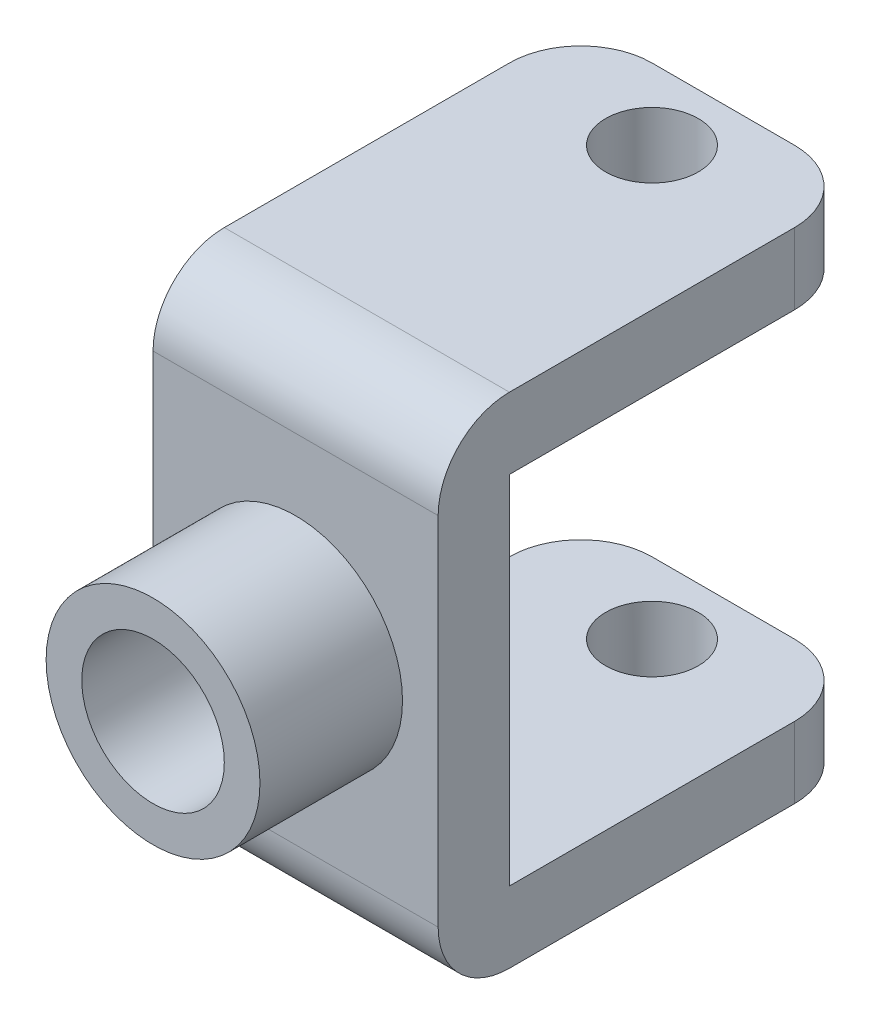
ISO-10303-21;
HEADER;
FILE_DESCRIPTION(('STEP AP214'),'2;1');
FILE_NAME('part.step','',(''),(''),'','','');
FILE_SCHEMA(('AUTOMOTIVE_DESIGN { 1 0 10303 214 1 1 1 1 }'));
ENDSEC;
DATA;
#1=APPLICATION_CONTEXT('core data for automotive mechanical design processes');
#2=APPLICATION_PROTOCOL_DEFINITION('international standard','automotive_design',2000,#1);
#3=PRODUCT_CONTEXT('',#1,'mechanical');
#4=PRODUCT('Part','Part','',(#3));
#5=PRODUCT_RELATED_PRODUCT_CATEGORY('part','',(#4));
#6=PRODUCT_DEFINITION_FORMATION('','',#4);
#7=PRODUCT_DEFINITION_CONTEXT('part definition',#1,'design');
#8=PRODUCT_DEFINITION('design','',#6,#7);
#9=PRODUCT_DEFINITION_SHAPE('','',#8);
#10=(LENGTH_UNIT() NAMED_UNIT(*) SI_UNIT(.MILLI.,.METRE.));
#11=(NAMED_UNIT(*) PLANE_ANGLE_UNIT() SI_UNIT($,.RADIAN.));
#12=(NAMED_UNIT(*) SI_UNIT($,.STERADIAN.) SOLID_ANGLE_UNIT());
#13=UNCERTAINTY_MEASURE_WITH_UNIT(LENGTH_MEASURE(1.E-05),#10,'distance_accuracy_value','');
#14=(GEOMETRIC_REPRESENTATION_CONTEXT(3) GLOBAL_UNCERTAINTY_ASSIGNED_CONTEXT((#13)) GLOBAL_UNIT_ASSIGNED_CONTEXT((#10,
#11,#12)) REPRESENTATION_CONTEXT('',''));
#15=CARTESIAN_POINT('',(0.,0.,0.));
#16=DIRECTION('',(0.,0.,1.));
#17=DIRECTION('',(1.,0.,0.));
#18=AXIS2_PLACEMENT_3D('',#15,#16,#17);
#19=CARTESIAN_POINT('',(20.,-25.,10.));
#20=DIRECTION('',(-1.,0.,0.));
#21=DIRECTION('',(0.,0.,1.));
#22=AXIS2_PLACEMENT_3D('',#19,#20,#21);
#23=PLANE('',#22);
#24=DIRECTION('',(0.,0.,1.));
#25=VECTOR('',#24,1.);
#26=CARTESIAN_POINT('',(20.,35.,10.));
#27=LINE('',#26,#25);
#28=CARTESIAN_POINT('',(20.,35.,-40.));
#29=VERTEX_POINT('',#28);
#30=CARTESIAN_POINT('',(20.,35.,0.));
#31=VERTEX_POINT('',#30);
#32=EDGE_CURVE('E232',#29,#31,#27,.T.);
#33=ORIENTED_EDGE('',*,*,#32,.T.);
#34=CARTESIAN_POINT('',(20.,25.,0.));
#35=DIRECTION('',(-1.,0.,0.));
#36=DIRECTION('',(0.,0.,1.));
#37=AXIS2_PLACEMENT_3D('',#34,#35,#36);
#38=CIRCLE('',#37,10.);
#39=CARTESIAN_POINT('',(20.,25.,10.));
#40=VERTEX_POINT('',#39);
#41=EDGE_CURVE('E203',#31,#40,#38,.F.);
#42=ORIENTED_EDGE('',*,*,#41,.T.);
#43=DIRECTION('',(0.,1.,0.));
#44=VECTOR('',#43,1.);
#45=CARTESIAN_POINT('',(20.,-25.,10.));
#46=LINE('',#45,#44);
#47=CARTESIAN_POINT('',(20.,-25.,10.));
#48=VERTEX_POINT('',#47);
#49=EDGE_CURVE('E169',#48,#40,#46,.T.);
#50=ORIENTED_EDGE('',*,*,#49,.F.);
#51=CARTESIAN_POINT('',(20.,-25.,0.));
#52=DIRECTION('',(-1.,0.,0.));
#53=DIRECTION('',(0.,0.,1.));
#54=AXIS2_PLACEMENT_3D('',#51,#52,#53);
#55=CIRCLE('',#54,10.);
#56=CARTESIAN_POINT('',(20.,-35.,0.));
#57=VERTEX_POINT('',#56);
#58=EDGE_CURVE('E201',#48,#57,#55,.F.);
#59=ORIENTED_EDGE('',*,*,#58,.T.);
#60=DIRECTION('',(0.,0.,-1.));
#61=VECTOR('',#60,1.);
#62=CARTESIAN_POINT('',(20.,-35.,10.));
#63=LINE('',#62,#61);
#64=CARTESIAN_POINT('',(20.,-35.,-40.));
#65=VERTEX_POINT('',#64);
#66=EDGE_CURVE('E153',#57,#65,#63,.T.);
#67=ORIENTED_EDGE('',*,*,#66,.T.);
#68=DIRECTION('',(0.,1.,0.));
#69=VECTOR('',#68,1.);
#70=CARTESIAN_POINT('',(20.,-25.,-40.));
#71=LINE('',#70,#69);
#72=CARTESIAN_POINT('',(20.,-25.,-40.));
#73=VERTEX_POINT('',#72);
#74=EDGE_CURVE('E150',#65,#73,#71,.T.);
#75=ORIENTED_EDGE('',*,*,#74,.T.);
#76=DIRECTION('',(0.,0.,1.));
#77=VECTOR('',#76,1.);
#78=CARTESIAN_POINT('',(20.,-25.,10.));
#79=LINE('',#78,#77);
#80=CARTESIAN_POINT('',(20.,-25.,0.));
#81=VERTEX_POINT('',#80);
#82=EDGE_CURVE('E142',#73,#81,#79,.T.);
#83=ORIENTED_EDGE('',*,*,#82,.T.);
#84=DIRECTION('',(0.,1.,0.));
#85=VECTOR('',#84,1.);
#86=CARTESIAN_POINT('',(20.,-25.,0.));
#87=LINE('',#86,#85);
#88=CARTESIAN_POINT('',(20.,25.,0.));
#89=VERTEX_POINT('',#88);
#90=EDGE_CURVE('E146',#81,#89,#87,.T.);
#91=ORIENTED_EDGE('',*,*,#90,.T.);
#92=DIRECTION('',(0.,0.,-1.));
#93=VECTOR('',#92,1.);
#94=CARTESIAN_POINT('',(20.,25.,10.));
#95=LINE('',#94,#93);
#96=CARTESIAN_POINT('',(20.,25.,-40.));
#97=VERTEX_POINT('',#96);
#98=EDGE_CURVE('E228',#89,#97,#95,.T.);
#99=ORIENTED_EDGE('',*,*,#98,.T.);
#100=DIRECTION('',(0.,1.,0.));
#101=VECTOR('',#100,1.);
#102=CARTESIAN_POINT('',(20.,-25.,-40.));
#103=LINE('',#102,#101);
#104=EDGE_CURVE('E197',#97,#29,#103,.T.);
#105=ORIENTED_EDGE('',*,*,#104,.T.);
#106=EDGE_LOOP('',(#33,#42,#50,#59,#67,#75,#83,#91,#99,#105));
#107=FACE_BOUND('',#106,.T.);
#108=ADVANCED_FACE('F39',(#107),#23,.F.);
#109=CARTESIAN_POINT('',(-20.,-25.,10.));
#110=DIRECTION('',(1.,0.,0.));
#111=DIRECTION('',(0.,0.,-1.));
#112=AXIS2_PLACEMENT_3D('',#109,#110,#111);
#113=PLANE('',#112);
#114=DIRECTION('',(0.,-1.,0.));
#115=VECTOR('',#114,1.);
#116=CARTESIAN_POINT('',(-20.,-25.,10.));
#117=LINE('',#116,#115);
#118=CARTESIAN_POINT('',(-20.,25.,10.));
#119=VERTEX_POINT('',#118);
#120=CARTESIAN_POINT('',(-20.,-25.,10.));
#121=VERTEX_POINT('',#120);
#122=EDGE_CURVE('E173',#119,#121,#117,.T.);
#123=ORIENTED_EDGE('',*,*,#122,.F.);
#124=CARTESIAN_POINT('',(-20.,25.,0.));
#125=DIRECTION('',(1.,0.,0.));
#126=DIRECTION('',(0.,0.,-1.));
#127=AXIS2_PLACEMENT_3D('',#124,#125,#126);
#128=CIRCLE('',#127,10.);
#129=CARTESIAN_POINT('',(-20.,35.,0.));
#130=VERTEX_POINT('',#129);
#131=EDGE_CURVE('E189',#119,#130,#128,.F.);
#132=ORIENTED_EDGE('',*,*,#131,.T.);
#133=DIRECTION('',(0.,0.,1.));
#134=VECTOR('',#133,1.);
#135=CARTESIAN_POINT('',(-20.,35.,10.));
#136=LINE('',#135,#134);
#137=CARTESIAN_POINT('',(-20.,35.,-40.));
#138=VERTEX_POINT('',#137);
#139=EDGE_CURVE('E233',#138,#130,#136,.T.);
#140=ORIENTED_EDGE('',*,*,#139,.F.);
#141=DIRECTION('',(0.,1.,0.));
#142=VECTOR('',#141,1.);
#143=CARTESIAN_POINT('',(-20.,-25.,-40.));
#144=LINE('',#143,#142);
#145=CARTESIAN_POINT('',(-20.,25.,-40.));
#146=VERTEX_POINT('',#145);
#147=EDGE_CURVE('E183',#138,#146,#144,.F.);
#148=ORIENTED_EDGE('',*,*,#147,.T.);
#149=DIRECTION('',(0.,0.,-1.));
#150=VECTOR('',#149,1.);
#151=CARTESIAN_POINT('',(-20.,25.,10.));
#152=LINE('',#151,#150);
#153=CARTESIAN_POINT('',(-20.,25.,0.));
#154=VERTEX_POINT('',#153);
#155=EDGE_CURVE('E256',#154,#146,#152,.T.);
#156=ORIENTED_EDGE('',*,*,#155,.F.);
#157=DIRECTION('',(0.,-1.,0.));
#158=VECTOR('',#157,1.);
#159=CARTESIAN_POINT('',(-20.,-25.,0.));
#160=LINE('',#159,#158);
#161=CARTESIAN_POINT('',(-20.,-25.,0.));
#162=VERTEX_POINT('',#161);
#163=EDGE_CURVE('E170',#154,#162,#160,.T.);
#164=ORIENTED_EDGE('',*,*,#163,.T.);
#165=DIRECTION('',(0.,0.,1.));
#166=VECTOR('',#165,1.);
#167=CARTESIAN_POINT('',(-20.,-25.,10.));
#168=LINE('',#167,#166);
#169=CARTESIAN_POINT('',(-20.,-25.,-40.));
#170=VERTEX_POINT('',#169);
#171=EDGE_CURVE('E167',#170,#162,#168,.T.);
#172=ORIENTED_EDGE('',*,*,#171,.F.);
#173=DIRECTION('',(0.,1.,0.));
#174=VECTOR('',#173,1.);
#175=CARTESIAN_POINT('',(-20.,-25.,-40.));
#176=LINE('',#175,#174);
#177=CARTESIAN_POINT('',(-20.,-35.,-40.));
#178=VERTEX_POINT('',#177);
#179=EDGE_CURVE('E185',#170,#178,#176,.F.);
#180=ORIENTED_EDGE('',*,*,#179,.T.);
#181=DIRECTION('',(0.,0.,-1.));
#182=VECTOR('',#181,1.);
#183=CARTESIAN_POINT('',(-20.,-35.,10.));
#184=LINE('',#183,#182);
#185=CARTESIAN_POINT('',(-20.,-35.,0.));
#186=VERTEX_POINT('',#185);
#187=EDGE_CURVE('E254',#186,#178,#184,.T.);
#188=ORIENTED_EDGE('',*,*,#187,.F.);
#189=CARTESIAN_POINT('',(-20.,-25.,0.));
#190=DIRECTION('',(1.,0.,0.));
#191=DIRECTION('',(0.,0.,-1.));
#192=AXIS2_PLACEMENT_3D('',#189,#190,#191);
#193=CIRCLE('',#192,10.);
#194=EDGE_CURVE('E187',#186,#121,#193,.F.);
#195=ORIENTED_EDGE('',*,*,#194,.T.);
#196=EDGE_LOOP('',(#123,#132,#140,#148,#156,#164,#172,#180,#188,#195));
#197=FACE_BOUND('',#196,.T.);
#198=ADVANCED_FACE('F263',(#197),#113,.F.);
#199=CARTESIAN_POINT('',(0.,0.,10.));
#200=DIRECTION('',(0.,0.,-1.));
#201=DIRECTION('',(-1.,0.,0.));
#202=AXIS2_PLACEMENT_3D('',#199,#200,#201);
#203=PLANE('',#202);
#204=CARTESIAN_POINT('',(0.,0.,10.));
#205=DIRECTION('',(0.,0.,-1.));
#206=DIRECTION('',(-1.,0.,0.));
#207=AXIS2_PLACEMENT_3D('',#204,#205,#206);
#208=CIRCLE('',#207,15.);
#209=CARTESIAN_POINT('',(-15.,0.,10.));
#210=VERTEX_POINT('',#209);
#211=EDGE_CURVE('E11',#210,#210,#208,.F.);
#212=ORIENTED_EDGE('',*,*,#211,.F.);
#213=EDGE_LOOP('',(#212));
#214=FACE_BOUND('',#213,.T.);
#215=ORIENTED_EDGE('',*,*,#49,.T.);
#216=DIRECTION('',(-1.,0.,0.));
#217=VECTOR('',#216,1.);
#218=CARTESIAN_POINT('',(0.,25.,10.));
#219=LINE('',#218,#217);
#220=EDGE_CURVE('E180',#40,#119,#219,.T.);
#221=ORIENTED_EDGE('',*,*,#220,.T.);
#222=ORIENTED_EDGE('',*,*,#122,.T.);
#223=DIRECTION('',(-1.,0.,0.));
#224=VECTOR('',#223,1.);
#225=CARTESIAN_POINT('',(0.,-25.,10.));
#226=LINE('',#225,#224);
#227=EDGE_CURVE('E178',#121,#48,#226,.F.);
#228=ORIENTED_EDGE('',*,*,#227,.T.);
#229=EDGE_LOOP('',(#215,#221,#222,#228));
#230=FACE_BOUND('',#229,.T.);
#231=ADVANCED_FACE('F307',(#214,#230),#203,.F.);
#232=CARTESIAN_POINT('',(0.,0.,0.));
#233=DIRECTION('',(0.,0.,-1.));
#234=DIRECTION('',(-1.,0.,0.));
#235=AXIS2_PLACEMENT_3D('',#232,#233,#234);
#236=PLANE('',#235);
#237=ORIENTED_EDGE('',*,*,#90,.F.);
#238=DIRECTION('',(1.,0.,0.));
#239=VECTOR('',#238,1.);
#240=CARTESIAN_POINT('',(-20.,-25.,0.));
#241=LINE('',#240,#239);
#242=EDGE_CURVE('E159',#162,#81,#241,.T.);
#243=ORIENTED_EDGE('',*,*,#242,.F.);
#244=ORIENTED_EDGE('',*,*,#163,.F.);
#245=DIRECTION('',(-1.,0.,0.));
#246=VECTOR('',#245,1.);
#247=CARTESIAN_POINT('',(-20.,25.,0.));
#248=LINE('',#247,#246);
#249=EDGE_CURVE('E161',#89,#154,#248,.T.);
#250=ORIENTED_EDGE('',*,*,#249,.F.);
#251=EDGE_LOOP('',(#237,#243,#244,#250));
#252=FACE_BOUND('',#251,.T.);
#253=ADVANCED_FACE('F158',(#252),#236,.T.);
#254=CARTESIAN_POINT('',(20.,-25.,10.));
#255=DIRECTION('',(0.,-1.,0.));
#256=DIRECTION('',(0.,0.,-1.));
#257=AXIS2_PLACEMENT_3D('',#254,#255,#256);
#258=PLANE('',#257);
#259=CARTESIAN_POINT('',(0.,-25.,-40.));
#260=DIRECTION('',(0.,-1.,0.));
#261=DIRECTION('',(0.,0.,-1.));
#262=AXIS2_PLACEMENT_3D('',#259,#260,#261);
#263=CIRCLE('',#262,6.5);
#264=CARTESIAN_POINT('',(0.,-25.,-46.5));
#265=VERTEX_POINT('',#264);
#266=EDGE_CURVE('E273',#265,#265,#263,.T.);
#267=ORIENTED_EDGE('',*,*,#266,.T.);
#268=EDGE_LOOP('',(#267));
#269=FACE_BOUND('',#268,.T.);
#270=DIRECTION('',(-1.,0.,0.));
#271=VECTOR('',#270,1.);
#272=CARTESIAN_POINT('',(20.,-25.,-50.));
#273=LINE('',#272,#271);
#274=CARTESIAN_POINT('',(10.,-25.,-50.));
#275=VERTEX_POINT('',#274);
#276=CARTESIAN_POINT('',(-10.,-25.,-50.));
#277=VERTEX_POINT('',#276);
#278=EDGE_CURVE('E154',#275,#277,#273,.T.);
#279=ORIENTED_EDGE('',*,*,#278,.T.);
#280=CARTESIAN_POINT('',(-10.,-25.,-40.));
#281=DIRECTION('',(0.,-1.,0.));
#282=DIRECTION('',(0.,0.,-1.));
#283=AXIS2_PLACEMENT_3D('',#280,#281,#282);
#284=CIRCLE('',#283,10.);
#285=EDGE_CURVE('E219',#277,#170,#284,.F.);
#286=ORIENTED_EDGE('',*,*,#285,.T.);
#287=ORIENTED_EDGE('',*,*,#171,.T.);
#288=ORIENTED_EDGE('',*,*,#242,.T.);
#289=ORIENTED_EDGE('',*,*,#82,.F.);
#290=CARTESIAN_POINT('',(10.,-25.,-40.));
#291=DIRECTION('',(0.,-1.,0.));
#292=DIRECTION('',(0.,0.,-1.));
#293=AXIS2_PLACEMENT_3D('',#290,#291,#292);
#294=CIRCLE('',#293,10.);
#295=EDGE_CURVE('E217',#73,#275,#294,.F.);
#296=ORIENTED_EDGE('',*,*,#295,.T.);
#297=EDGE_LOOP('',(#279,#286,#287,#288,#289,#296));
#298=FACE_BOUND('',#297,.T.);
#299=ADVANCED_FACE('F165',(#269,#298),#258,.F.);
#300=CARTESIAN_POINT('',(20.,-35.,10.));
#301=DIRECTION('',(0.,1.,0.));
#302=DIRECTION('',(0.,0.,1.));
#303=AXIS2_PLACEMENT_3D('',#300,#301,#302);
#304=PLANE('',#303);
#305=CARTESIAN_POINT('',(0.,-35.,-40.));
#306=DIRECTION('',(0.,1.,0.));
#307=DIRECTION('',(0.,0.,1.));
#308=AXIS2_PLACEMENT_3D('',#305,#306,#307);
#309=CIRCLE('',#308,6.5);
#310=CARTESIAN_POINT('',(0.,-35.,-33.5));
#311=VERTEX_POINT('',#310);
#312=EDGE_CURVE('E281',#311,#311,#309,.T.);
#313=ORIENTED_EDGE('',*,*,#312,.T.);
#314=EDGE_LOOP('',(#313));
#315=FACE_BOUND('',#314,.T.);
#316=ORIENTED_EDGE('',*,*,#66,.F.);
#317=DIRECTION('',(-1.,0.,0.));
#318=VECTOR('',#317,1.);
#319=CARTESIAN_POINT('',(20.,-35.,0.));
#320=LINE('',#319,#318);
#321=EDGE_CURVE('E209',#57,#186,#320,.T.);
#322=ORIENTED_EDGE('',*,*,#321,.T.);
#323=ORIENTED_EDGE('',*,*,#187,.T.);
#324=CARTESIAN_POINT('',(-10.,-35.,-40.));
#325=DIRECTION('',(0.,1.,0.));
#326=DIRECTION('',(0.,0.,1.));
#327=AXIS2_PLACEMENT_3D('',#324,#325,#326);
#328=CIRCLE('',#327,10.);
#329=CARTESIAN_POINT('',(-10.,-35.,-50.));
#330=VERTEX_POINT('',#329);
#331=EDGE_CURVE('E207',#178,#330,#328,.F.);
#332=ORIENTED_EDGE('',*,*,#331,.T.);
#333=DIRECTION('',(-1.,0.,0.));
#334=VECTOR('',#333,1.);
#335=CARTESIAN_POINT('',(20.,-35.,-50.));
#336=LINE('',#335,#334);
#337=CARTESIAN_POINT('',(10.,-35.,-50.));
#338=VERTEX_POINT('',#337);
#339=EDGE_CURVE('E248',#338,#330,#336,.T.);
#340=ORIENTED_EDGE('',*,*,#339,.F.);
#341=CARTESIAN_POINT('',(10.,-35.,-40.));
#342=DIRECTION('',(0.,1.,0.));
#343=DIRECTION('',(0.,0.,1.));
#344=AXIS2_PLACEMENT_3D('',#341,#342,#343);
#345=CIRCLE('',#344,10.);
#346=EDGE_CURVE('E205',#338,#65,#345,.F.);
#347=ORIENTED_EDGE('',*,*,#346,.T.);
#348=EDGE_LOOP('',(#316,#322,#323,#332,#340,#347));
#349=FACE_BOUND('',#348,.T.);
#350=ADVANCED_FACE('F288',(#315,#349),#304,.F.);
#351=CARTESIAN_POINT('',(20.,-25.,-50.));
#352=DIRECTION('',(0.,0.,1.));
#353=DIRECTION('',(1.,0.,0.));
#354=AXIS2_PLACEMENT_3D('',#351,#352,#353);
#355=PLANE('',#354);
#356=ORIENTED_EDGE('',*,*,#339,.T.);
#357=DIRECTION('',(0.,1.,0.));
#358=VECTOR('',#357,1.);
#359=CARTESIAN_POINT('',(-10.,-25.,-50.));
#360=LINE('',#359,#358);
#361=EDGE_CURVE('E214',#330,#277,#360,.T.);
#362=ORIENTED_EDGE('',*,*,#361,.T.);
#363=ORIENTED_EDGE('',*,*,#278,.F.);
#364=DIRECTION('',(0.,1.,0.));
#365=VECTOR('',#364,1.);
#366=CARTESIAN_POINT('',(10.,-25.,-50.));
#367=LINE('',#366,#365);
#368=EDGE_CURVE('E212',#275,#338,#367,.F.);
#369=ORIENTED_EDGE('',*,*,#368,.T.);
#370=EDGE_LOOP('',(#356,#362,#363,#369));
#371=FACE_BOUND('',#370,.T.);
#372=ADVANCED_FACE('F304',(#371),#355,.F.);
#373=CARTESIAN_POINT('',(20.,25.,10.));
#374=DIRECTION('',(0.,1.,0.));
#375=DIRECTION('',(0.,0.,1.));
#376=AXIS2_PLACEMENT_3D('',#373,#374,#375);
#377=PLANE('',#376);
#378=CARTESIAN_POINT('',(0.,25.,-40.));
#379=DIRECTION('',(0.,1.,0.));
#380=DIRECTION('',(0.,0.,1.));
#381=AXIS2_PLACEMENT_3D('',#378,#379,#380);
#382=CIRCLE('',#381,6.5);
#383=CARTESIAN_POINT('',(0.,25.,-33.5));
#384=VERTEX_POINT('',#383);
#385=EDGE_CURVE('E278',#384,#384,#382,.T.);
#386=ORIENTED_EDGE('',*,*,#385,.T.);
#387=EDGE_LOOP('',(#386));
#388=FACE_BOUND('',#387,.T.);
#389=ORIENTED_EDGE('',*,*,#155,.T.);
#390=CARTESIAN_POINT('',(-10.,25.,-40.));
#391=DIRECTION('',(0.,1.,0.));
#392=DIRECTION('',(0.,0.,1.));
#393=AXIS2_PLACEMENT_3D('',#390,#391,#392);
#394=CIRCLE('',#393,10.);
#395=CARTESIAN_POINT('',(-10.,25.,-50.));
#396=VERTEX_POINT('',#395);
#397=EDGE_CURVE('E47',#146,#396,#394,.F.);
#398=ORIENTED_EDGE('',*,*,#397,.T.);
#399=DIRECTION('',(-1.,0.,0.));
#400=VECTOR('',#399,1.);
#401=CARTESIAN_POINT('',(20.,25.,-50.));
#402=LINE('',#401,#400);
#403=CARTESIAN_POINT('',(10.,25.,-50.));
#404=VERTEX_POINT('',#403);
#405=EDGE_CURVE('E162',#404,#396,#402,.T.);
#406=ORIENTED_EDGE('',*,*,#405,.F.);
#407=CARTESIAN_POINT('',(10.,25.,-40.));
#408=DIRECTION('',(0.,1.,0.));
#409=DIRECTION('',(0.,0.,1.));
#410=AXIS2_PLACEMENT_3D('',#407,#408,#409);
#411=CIRCLE('',#410,10.);
#412=EDGE_CURVE('E225',#404,#97,#411,.F.);
#413=ORIENTED_EDGE('',*,*,#412,.T.);
#414=ORIENTED_EDGE('',*,*,#98,.F.);
#415=ORIENTED_EDGE('',*,*,#249,.T.);
#416=EDGE_LOOP('',(#389,#398,#406,#413,#414,#415));
#417=FACE_BOUND('',#416,.T.);
#418=ADVANCED_FACE('F227',(#388,#417),#377,.F.);
#419=CARTESIAN_POINT('',(20.,25.,-50.));
#420=DIRECTION('',(0.,0.,1.));
#421=DIRECTION('',(1.,0.,0.));
#422=AXIS2_PLACEMENT_3D('',#419,#420,#421);
#423=PLANE('',#422);
#424=ORIENTED_EDGE('',*,*,#405,.T.);
#425=DIRECTION('',(0.,1.,0.));
#426=VECTOR('',#425,1.);
#427=CARTESIAN_POINT('',(-10.,25.,-50.));
#428=LINE('',#427,#426);
#429=CARTESIAN_POINT('',(-10.,35.,-50.));
#430=VERTEX_POINT('',#429);
#431=EDGE_CURVE('E222',#396,#430,#428,.T.);
#432=ORIENTED_EDGE('',*,*,#431,.T.);
#433=DIRECTION('',(-1.,0.,0.));
#434=VECTOR('',#433,1.);
#435=CARTESIAN_POINT('',(20.,35.,-50.));
#436=LINE('',#435,#434);
#437=CARTESIAN_POINT('',(10.,35.,-50.));
#438=VERTEX_POINT('',#437);
#439=EDGE_CURVE('E239',#438,#430,#436,.T.);
#440=ORIENTED_EDGE('',*,*,#439,.F.);
#441=DIRECTION('',(0.,1.,0.));
#442=VECTOR('',#441,1.);
#443=CARTESIAN_POINT('',(10.,25.,-50.));
#444=LINE('',#443,#442);
#445=EDGE_CURVE('E60',#438,#404,#444,.F.);
#446=ORIENTED_EDGE('',*,*,#445,.T.);
#447=EDGE_LOOP('',(#424,#432,#440,#446));
#448=FACE_BOUND('',#447,.T.);
#449=ADVANCED_FACE('F240',(#448),#423,.F.);
#450=CARTESIAN_POINT('',(20.,35.,10.));
#451=DIRECTION('',(0.,-1.,0.));
#452=DIRECTION('',(0.,0.,-1.));
#453=AXIS2_PLACEMENT_3D('',#450,#451,#452);
#454=PLANE('',#453);
#455=CARTESIAN_POINT('',(0.,35.,-40.));
#456=DIRECTION('',(0.,1.,0.));
#457=DIRECTION('',(0.,0.,1.));
#458=AXIS2_PLACEMENT_3D('',#455,#456,#457);
#459=CIRCLE('',#458,6.5);
#460=CARTESIAN_POINT('',(0.,35.,-33.5));
#461=VERTEX_POINT('',#460);
#462=EDGE_CURVE('E282',#461,#461,#459,.T.);
#463=ORIENTED_EDGE('',*,*,#462,.F.);
#464=EDGE_LOOP('',(#463));
#465=FACE_BOUND('',#464,.T.);
#466=ORIENTED_EDGE('',*,*,#139,.T.);
#467=DIRECTION('',(-1.,0.,0.));
#468=VECTOR('',#467,1.);
#469=CARTESIAN_POINT('',(20.,35.,0.));
#470=LINE('',#469,#468);
#471=EDGE_CURVE('E195',#130,#31,#470,.F.);
#472=ORIENTED_EDGE('',*,*,#471,.T.);
#473=ORIENTED_EDGE('',*,*,#32,.F.);
#474=CARTESIAN_POINT('',(10.,35.,-40.));
#475=DIRECTION('',(0.,-1.,0.));
#476=DIRECTION('',(0.,0.,-1.));
#477=AXIS2_PLACEMENT_3D('',#474,#475,#476);
#478=CIRCLE('',#477,10.);
#479=EDGE_CURVE('E191',#29,#438,#478,.F.);
#480=ORIENTED_EDGE('',*,*,#479,.T.);
#481=ORIENTED_EDGE('',*,*,#439,.T.);
#482=CARTESIAN_POINT('',(-10.,35.,-40.));
#483=DIRECTION('',(0.,-1.,0.));
#484=DIRECTION('',(0.,0.,-1.));
#485=AXIS2_PLACEMENT_3D('',#482,#483,#484);
#486=CIRCLE('',#485,10.);
#487=EDGE_CURVE('E193',#430,#138,#486,.F.);
#488=ORIENTED_EDGE('',*,*,#487,.T.);
#489=EDGE_LOOP('',(#466,#472,#473,#480,#481,#488));
#490=FACE_BOUND('',#489,.T.);
#491=ADVANCED_FACE('F238',(#465,#490),#454,.F.);
#492=CARTESIAN_POINT('',(0.,25.,0.));
#493=DIRECTION('',(-1.,0.,0.));
#494=DIRECTION('',(0.,0.,1.));
#495=AXIS2_PLACEMENT_3D('',#492,#493,#494);
#496=CYLINDRICAL_SURFACE('',#495,10.);
#497=ORIENTED_EDGE('',*,*,#41,.F.);
#498=ORIENTED_EDGE('',*,*,#471,.F.);
#499=ORIENTED_EDGE('',*,*,#131,.F.);
#500=ORIENTED_EDGE('',*,*,#220,.F.);
#501=EDGE_LOOP('',(#497,#498,#499,#500));
#502=FACE_BOUND('',#501,.T.);
#503=ADVANCED_FACE('F318',(#502),#496,.T.);
#504=CARTESIAN_POINT('',(20.,-25.,0.));
#505=DIRECTION('',(-1.,0.,0.));
#506=DIRECTION('',(0.,0.,1.));
#507=AXIS2_PLACEMENT_3D('',#504,#505,#506);
#508=CYLINDRICAL_SURFACE('',#507,10.);
#509=ORIENTED_EDGE('',*,*,#58,.F.);
#510=ORIENTED_EDGE('',*,*,#227,.F.);
#511=ORIENTED_EDGE('',*,*,#194,.F.);
#512=ORIENTED_EDGE('',*,*,#321,.F.);
#513=EDGE_LOOP('',(#509,#510,#511,#512));
#514=FACE_BOUND('',#513,.T.);
#515=ADVANCED_FACE('F321',(#514),#508,.T.);
#516=CARTESIAN_POINT('',(-10.,-25.,-40.));
#517=DIRECTION('',(0.,1.,0.));
#518=DIRECTION('',(0.,0.,1.));
#519=AXIS2_PLACEMENT_3D('',#516,#517,#518);
#520=CYLINDRICAL_SURFACE('',#519,10.);
#521=ORIENTED_EDGE('',*,*,#331,.F.);
#522=ORIENTED_EDGE('',*,*,#179,.F.);
#523=ORIENTED_EDGE('',*,*,#285,.F.);
#524=ORIENTED_EDGE('',*,*,#361,.F.);
#525=EDGE_LOOP('',(#521,#522,#523,#524));
#526=FACE_BOUND('',#525,.T.);
#527=ADVANCED_FACE('F325',(#526),#520,.T.);
#528=CARTESIAN_POINT('',(10.,-25.,-40.));
#529=DIRECTION('',(0.,1.,0.));
#530=DIRECTION('',(0.,0.,1.));
#531=AXIS2_PLACEMENT_3D('',#528,#529,#530);
#532=CYLINDRICAL_SURFACE('',#531,10.);
#533=ORIENTED_EDGE('',*,*,#346,.F.);
#534=ORIENTED_EDGE('',*,*,#368,.F.);
#535=ORIENTED_EDGE('',*,*,#295,.F.);
#536=ORIENTED_EDGE('',*,*,#74,.F.);
#537=EDGE_LOOP('',(#533,#534,#535,#536));
#538=FACE_BOUND('',#537,.T.);
#539=ADVANCED_FACE('F329',(#538),#532,.T.);
#540=CARTESIAN_POINT('',(-10.,25.,-40.));
#541=DIRECTION('',(0.,1.,0.));
#542=DIRECTION('',(0.,0.,1.));
#543=AXIS2_PLACEMENT_3D('',#540,#541,#542);
#544=CYLINDRICAL_SURFACE('',#543,10.);
#545=ORIENTED_EDGE('',*,*,#397,.F.);
#546=ORIENTED_EDGE('',*,*,#147,.F.);
#547=ORIENTED_EDGE('',*,*,#487,.F.);
#548=ORIENTED_EDGE('',*,*,#431,.F.);
#549=EDGE_LOOP('',(#545,#546,#547,#548));
#550=FACE_BOUND('',#549,.T.);
#551=ADVANCED_FACE('F332',(#550),#544,.T.);
#552=CARTESIAN_POINT('',(10.,-25.,-40.));
#553=DIRECTION('',(0.,1.,0.));
#554=DIRECTION('',(0.,0.,1.));
#555=AXIS2_PLACEMENT_3D('',#552,#553,#554);
#556=CYLINDRICAL_SURFACE('',#555,10.);
#557=ORIENTED_EDGE('',*,*,#412,.F.);
#558=ORIENTED_EDGE('',*,*,#445,.F.);
#559=ORIENTED_EDGE('',*,*,#479,.F.);
#560=ORIENTED_EDGE('',*,*,#104,.F.);
#561=EDGE_LOOP('',(#557,#558,#559,#560));
#562=FACE_BOUND('',#561,.T.);
#563=ADVANCED_FACE('F41',(#562),#556,.T.);
#564=CARTESIAN_POINT('',(0.,0.,30.));
#565=DIRECTION('',(0.,0.,1.));
#566=DIRECTION('',(1.,0.,0.));
#567=AXIS2_PLACEMENT_3D('',#564,#565,#566);
#568=PLANE('',#567);
#569=CARTESIAN_POINT('',(0.,0.,30.));
#570=DIRECTION('',(0.,0.,1.));
#571=DIRECTION('',(1.,0.,0.));
#572=AXIS2_PLACEMENT_3D('',#569,#570,#571);
#573=CIRCLE('',#572,15.);
#574=CARTESIAN_POINT('',(15.,0.,30.));
#575=VERTEX_POINT('',#574);
#576=EDGE_CURVE('E251',#575,#575,#573,.T.);
#577=ORIENTED_EDGE('',*,*,#576,.T.);
#578=EDGE_LOOP('',(#577));
#579=FACE_BOUND('',#578,.T.);
#580=CARTESIAN_POINT('',(0.,0.,30.));
#581=DIRECTION('',(0.,0.,1.));
#582=DIRECTION('',(1.,0.,0.));
#583=AXIS2_PLACEMENT_3D('',#580,#581,#582);
#584=CIRCLE('',#583,10.);
#585=CARTESIAN_POINT('',(10.,0.,30.));
#586=VERTEX_POINT('',#585);
#587=EDGE_CURVE('E269',#586,#586,#584,.T.);
#588=ORIENTED_EDGE('',*,*,#587,.F.);
#589=EDGE_LOOP('',(#588));
#590=FACE_BOUND('',#589,.T.);
#591=ADVANCED_FACE('F339',(#579,#590),#568,.T.);
#592=CARTESIAN_POINT('',(0.,0.,30.));
#593=DIRECTION('',(0.,0.,-1.));
#594=DIRECTION('',(-1.,0.,0.));
#595=AXIS2_PLACEMENT_3D('',#592,#593,#594);
#596=CYLINDRICAL_SURFACE('',#595,15.);
#597=ORIENTED_EDGE('',*,*,#576,.F.);
#598=EDGE_LOOP('',(#597));
#599=FACE_BOUND('',#598,.T.);
#600=ORIENTED_EDGE('',*,*,#211,.T.);
#601=EDGE_LOOP('',(#600));
#602=FACE_BOUND('',#601,.T.);
#603=ADVANCED_FACE('F370',(#599,#602),#596,.T.);
#604=CARTESIAN_POINT('',(0.,0.,30.));
#605=DIRECTION('',(0.,0.,-1.));
#606=DIRECTION('',(-1.,0.,0.));
#607=AXIS2_PLACEMENT_3D('',#604,#605,#606);
#608=CYLINDRICAL_SURFACE('',#607,10.);
#609=ORIENTED_EDGE('',*,*,#587,.T.);
#610=EDGE_LOOP('',(#609));
#611=FACE_BOUND('',#610,.T.);
#612=CARTESIAN_POINT('',(0.,0.,10.));
#613=DIRECTION('',(0.,0.,1.));
#614=DIRECTION('',(1.,0.,0.));
#615=AXIS2_PLACEMENT_3D('',#612,#613,#614);
#616=CIRCLE('',#615,10.);
#617=CARTESIAN_POINT('',(10.,0.,10.));
#618=VERTEX_POINT('',#617);
#619=EDGE_CURVE('E270',#618,#618,#616,.T.);
#620=ORIENTED_EDGE('',*,*,#619,.F.);
#621=EDGE_LOOP('',(#620));
#622=FACE_BOUND('',#621,.T.);
#623=ADVANCED_FACE('F373',(#611,#622),#608,.F.);
#624=ORIENTED_EDGE('',*,*,#619,.T.);
#625=EDGE_LOOP('',(#624));
#626=FACE_BOUND('',#625,.T.);
#627=ADVANCED_FACE('F379',(#626),#203,.F.);
#628=CARTESIAN_POINT('',(0.,-35.,-40.));
#629=DIRECTION('',(0.,1.,0.));
#630=DIRECTION('',(0.,0.,1.));
#631=AXIS2_PLACEMENT_3D('',#628,#629,#630);
#632=CYLINDRICAL_SURFACE('',#631,6.5);
#633=ORIENTED_EDGE('',*,*,#462,.T.);
#634=EDGE_LOOP('',(#633));
#635=FACE_BOUND('',#634,.T.);
#636=ORIENTED_EDGE('',*,*,#385,.F.);
#637=EDGE_LOOP('',(#636));
#638=FACE_BOUND('',#637,.T.);
#639=ADVANCED_FACE('F294',(#635,#638),#632,.F.);
#640=ORIENTED_EDGE('',*,*,#312,.F.);
#641=EDGE_LOOP('',(#640));
#642=FACE_BOUND('',#641,.T.);
#643=ORIENTED_EDGE('',*,*,#266,.F.);
#644=EDGE_LOOP('',(#643));
#645=FACE_BOUND('',#644,.T.);
#646=ADVANCED_FACE('F291',(#642,#645),#632,.F.);
#647=CLOSED_SHELL('',(#108,#198,#231,#253,#299,#350,#372,#418,#449,#491,#503,#515,#527,#539,
#551,#563,#591,#603,#623,#627,#639,#646));
#648=MANIFOLD_SOLID_BREP('B2',#647);
#649=ADVANCED_BREP_SHAPE_REPRESENTATION('',(#18,#648),#14);
#650=SHAPE_DEFINITION_REPRESENTATION(#9,#649);
ENDSEC;
END-ISO-10303-21;
